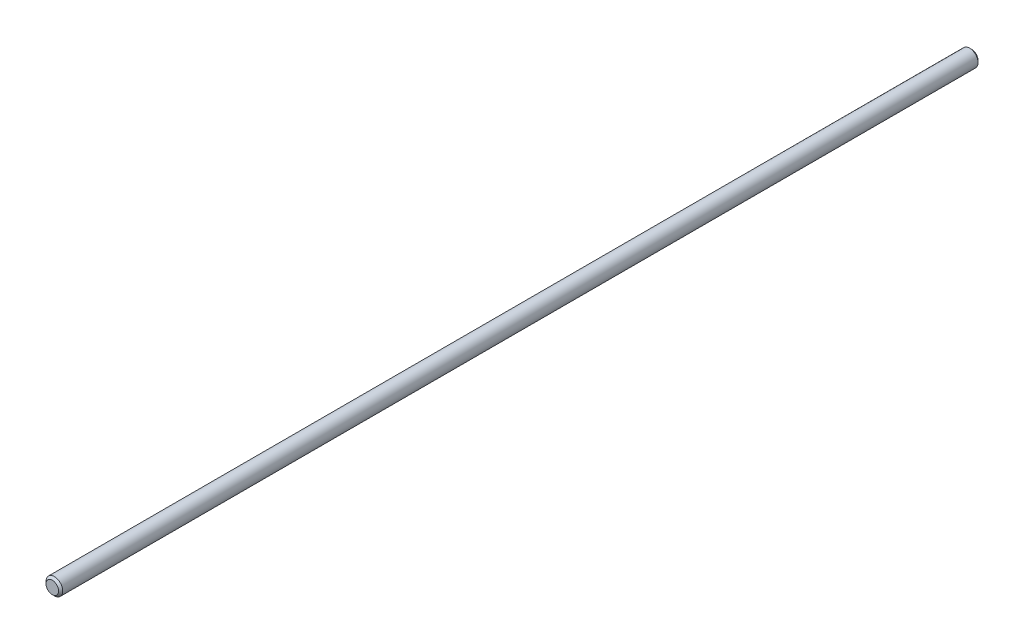
ISO-10303-21;
HEADER;
FILE_DESCRIPTION(('STEP AP214'),'2;1');
FILE_NAME('part.step','',(''),(''),'','','');
FILE_SCHEMA(('AUTOMOTIVE_DESIGN { 1 0 10303 214 1 1 1 1 }'));
ENDSEC;
DATA;
#1=APPLICATION_CONTEXT('core data for automotive mechanical design processes');
#2=APPLICATION_PROTOCOL_DEFINITION('international standard','automotive_design',2000,#1);
#3=PRODUCT_CONTEXT('',#1,'mechanical');
#4=PRODUCT('Part','Part','',(#3));
#5=PRODUCT_RELATED_PRODUCT_CATEGORY('part','',(#4));
#6=PRODUCT_DEFINITION_FORMATION('','',#4);
#7=PRODUCT_DEFINITION_CONTEXT('part definition',#1,'design');
#8=PRODUCT_DEFINITION('design','',#6,#7);
#9=PRODUCT_DEFINITION_SHAPE('','',#8);
#10=(LENGTH_UNIT() NAMED_UNIT(*) SI_UNIT(.MILLI.,.METRE.));
#11=(NAMED_UNIT(*) PLANE_ANGLE_UNIT() SI_UNIT($,.RADIAN.));
#12=(NAMED_UNIT(*) SI_UNIT($,.STERADIAN.) SOLID_ANGLE_UNIT());
#13=UNCERTAINTY_MEASURE_WITH_UNIT(LENGTH_MEASURE(1.E-05),#10,'distance_accuracy_value','');
#14=(GEOMETRIC_REPRESENTATION_CONTEXT(3) GLOBAL_UNCERTAINTY_ASSIGNED_CONTEXT((#13)) GLOBAL_UNIT_ASSIGNED_CONTEXT((#10,
#11,#12)) REPRESENTATION_CONTEXT('',''));
#15=CARTESIAN_POINT('',(0.,0.,0.));
#16=DIRECTION('',(0.,0.,1.));
#17=DIRECTION('',(1.,0.,0.));
#18=AXIS2_PLACEMENT_3D('',#15,#16,#17);
#19=CARTESIAN_POINT('',(0.,0.,110.));
#20=DIRECTION('',(0.,0.,-1.));
#21=DIRECTION('',(-1.,0.,0.));
#22=AXIS2_PLACEMENT_3D('',#19,#20,#21);
#23=CYLINDRICAL_SURFACE('',#22,2.);
#24=CARTESIAN_POINT('',(0.,0.,-109.5));
#25=DIRECTION('',(0.,0.,1.));
#26=DIRECTION('',(1.,0.,0.));
#27=AXIS2_PLACEMENT_3D('',#24,#25,#26);
#28=CIRCLE('',#27,2.);
#29=CARTESIAN_POINT('',(2.,0.,-109.5));
#30=VERTEX_POINT('',#29);
#31=EDGE_CURVE('E41',#30,#30,#28,.T.);
#32=ORIENTED_EDGE('',*,*,#31,.T.);
#33=EDGE_LOOP('',(#32));
#34=FACE_BOUND('',#33,.T.);
#35=CARTESIAN_POINT('',(0.,0.,109.5));
#36=DIRECTION('',(0.,0.,1.));
#37=DIRECTION('',(1.,0.,0.));
#38=AXIS2_PLACEMENT_3D('',#35,#36,#37);
#39=CIRCLE('',#38,2.);
#40=CARTESIAN_POINT('',(2.,0.,109.5));
#41=VERTEX_POINT('',#40);
#42=EDGE_CURVE('E45',#41,#41,#39,.F.);
#43=ORIENTED_EDGE('',*,*,#42,.T.);
#44=EDGE_LOOP('',(#43));
#45=FACE_BOUND('',#44,.T.);
#46=ADVANCED_FACE('F30',(#34,#45),#23,.T.);
#47=CARTESIAN_POINT('',(0.,0.,110.));
#48=DIRECTION('',(0.,0.,1.));
#49=DIRECTION('',(1.,0.,0.));
#50=AXIS2_PLACEMENT_3D('',#47,#48,#49);
#51=PLANE('',#50);
#52=CARTESIAN_POINT('',(0.,0.,110.));
#53=DIRECTION('',(0.,0.,1.));
#54=DIRECTION('',(1.,0.,0.));
#55=AXIS2_PLACEMENT_3D('',#52,#53,#54);
#56=CIRCLE('',#55,1.50000000000003);
#57=CARTESIAN_POINT('',(1.50000000000003,0.,110.));
#58=VERTEX_POINT('',#57);
#59=EDGE_CURVE('E10',#58,#58,#56,.T.);
#60=ORIENTED_EDGE('',*,*,#59,.T.);
#61=EDGE_LOOP('',(#60));
#62=FACE_BOUND('',#61,.T.);
#63=ADVANCED_FACE('F61',(#62),#51,.T.);
#64=CARTESIAN_POINT('',(0.,0.,-110.));
#65=DIRECTION('',(0.,0.,1.));
#66=DIRECTION('',(1.,0.,0.));
#67=AXIS2_PLACEMENT_3D('',#64,#65,#66);
#68=PLANE('',#67);
#69=CARTESIAN_POINT('',(0.,0.,-110.));
#70=DIRECTION('',(0.,0.,1.));
#71=DIRECTION('',(1.,0.,0.));
#72=AXIS2_PLACEMENT_3D('',#69,#70,#71);
#73=CIRCLE('',#72,1.5);
#74=CARTESIAN_POINT('',(1.5,0.,-110.));
#75=VERTEX_POINT('',#74);
#76=EDGE_CURVE('E37',#75,#75,#73,.F.);
#77=ORIENTED_EDGE('',*,*,#76,.T.);
#78=EDGE_LOOP('',(#77));
#79=FACE_BOUND('',#78,.T.);
#80=ADVANCED_FACE('F58',(#79),#68,.F.);
#81=CARTESIAN_POINT('',(0.,0.,-109.5));
#82=DIRECTION('',(0.,0.,1.));
#83=DIRECTION('',(1.,0.,0.));
#84=AXIS2_PLACEMENT_3D('',#81,#82,#83);
#85=CONICAL_SURFACE('',#84,2.,0.785398163397474);
#86=ORIENTED_EDGE('',*,*,#76,.F.);
#87=EDGE_LOOP('',(#86));
#88=FACE_BOUND('',#87,.T.);
#89=ORIENTED_EDGE('',*,*,#31,.F.);
#90=EDGE_LOOP('',(#89));
#91=FACE_BOUND('',#90,.T.);
#92=ADVANCED_FACE('F54',(#88,#91),#85,.T.);
#93=CARTESIAN_POINT('',(0.,0.,110.));
#94=DIRECTION('',(0.,0.,-1.));
#95=DIRECTION('',(-1.,0.,0.));
#96=AXIS2_PLACEMENT_3D('',#93,#94,#95);
#97=CONICAL_SURFACE('',#96,1.50000000000003,0.785398163397419);
#98=ORIENTED_EDGE('',*,*,#42,.F.);
#99=EDGE_LOOP('',(#98));
#100=FACE_BOUND('',#99,.T.);
#101=ORIENTED_EDGE('',*,*,#59,.F.);
#102=EDGE_LOOP('',(#101));
#103=FACE_BOUND('',#102,.T.);
#104=ADVANCED_FACE('F32',(#100,#103),#97,.T.);
#105=CLOSED_SHELL('',(#46,#63,#80,#92,#104));
#106=MANIFOLD_SOLID_BREP('B2',#105);
#107=ADVANCED_BREP_SHAPE_REPRESENTATION('',(#18,#106),#14);
#108=SHAPE_DEFINITION_REPRESENTATION(#9,#107);
ENDSEC;
END-ISO-10303-21;
